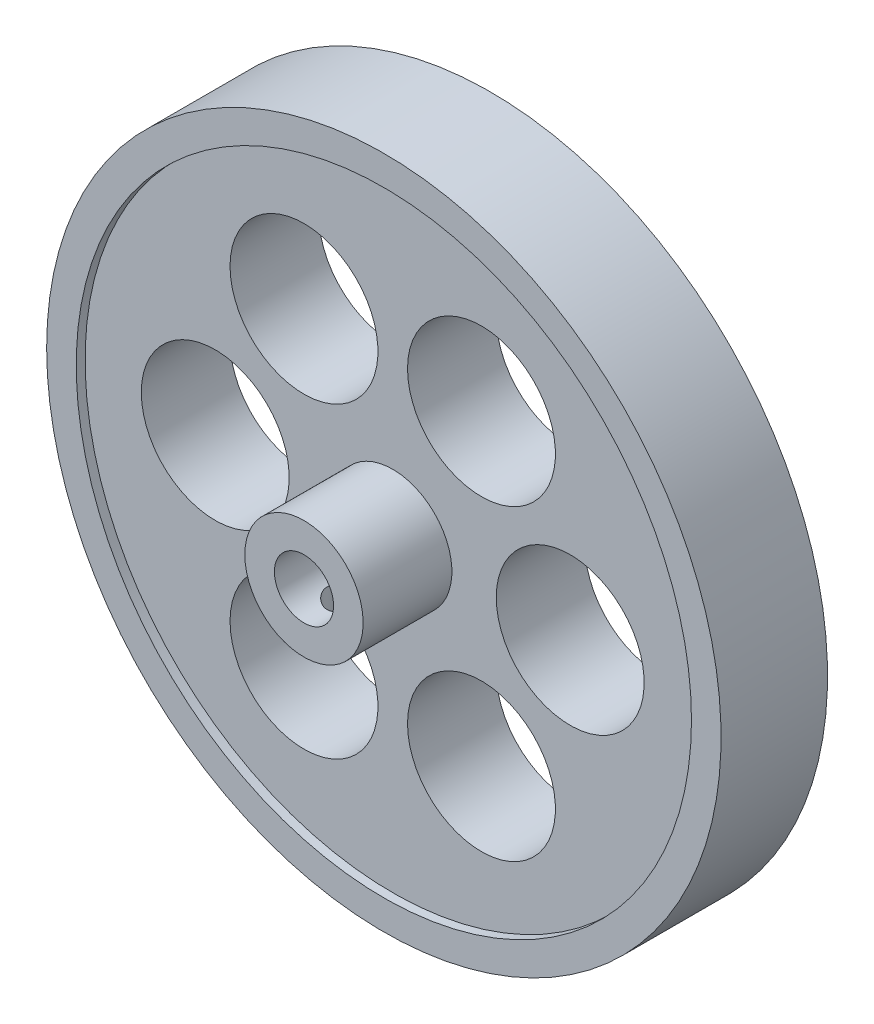
ISO-10303-21;
HEADER;
FILE_DESCRIPTION(('STEP AP214'),'2;1');
FILE_NAME('part.step','',(''),(''),'','','');
FILE_SCHEMA(('AUTOMOTIVE_DESIGN { 1 0 10303 214 1 1 1 1 }'));
ENDSEC;
DATA;
#1=APPLICATION_CONTEXT('core data for automotive mechanical design processes');
#2=APPLICATION_PROTOCOL_DEFINITION('international standard','automotive_design',2000,#1);
#3=PRODUCT_CONTEXT('',#1,'mechanical');
#4=PRODUCT('Part','Part','',(#3));
#5=PRODUCT_RELATED_PRODUCT_CATEGORY('part','',(#4));
#6=PRODUCT_DEFINITION_FORMATION('','',#4);
#7=PRODUCT_DEFINITION_CONTEXT('part definition',#1,'design');
#8=PRODUCT_DEFINITION('design','',#6,#7);
#9=PRODUCT_DEFINITION_SHAPE('','',#8);
#10=(LENGTH_UNIT() NAMED_UNIT(*) SI_UNIT(.MILLI.,.METRE.));
#11=(NAMED_UNIT(*) PLANE_ANGLE_UNIT() SI_UNIT($,.RADIAN.));
#12=(NAMED_UNIT(*) SI_UNIT($,.STERADIAN.) SOLID_ANGLE_UNIT());
#13=UNCERTAINTY_MEASURE_WITH_UNIT(LENGTH_MEASURE(1.E-05),#10,'distance_accuracy_value','');
#14=(GEOMETRIC_REPRESENTATION_CONTEXT(3) GLOBAL_UNCERTAINTY_ASSIGNED_CONTEXT((#13)) GLOBAL_UNIT_ASSIGNED_CONTEXT((#10,
#11,#12)) REPRESENTATION_CONTEXT('',''));
#15=CARTESIAN_POINT('',(0.,0.,0.));
#16=DIRECTION('',(0.,0.,1.));
#17=DIRECTION('',(1.,0.,0.));
#18=AXIS2_PLACEMENT_3D('',#15,#16,#17);
#19=CARTESIAN_POINT('',(0.,0.,9.));
#20=DIRECTION('',(0.,0.,-1.));
#21=DIRECTION('',(-1.,0.,0.));
#22=AXIS2_PLACEMENT_3D('',#19,#20,#21);
#23=CYLINDRICAL_SURFACE('',#22,57.);
#24=CARTESIAN_POINT('',(0.,0.,9.));
#25=DIRECTION('',(0.,0.,-1.));
#26=DIRECTION('',(-1.,0.,0.));
#27=AXIS2_PLACEMENT_3D('',#24,#25,#26);
#28=CIRCLE('',#27,57.);
#29=CARTESIAN_POINT('',(-57.,0.,9.));
#30=VERTEX_POINT('',#29);
#31=EDGE_CURVE('E10',#30,#30,#28,.T.);
#32=ORIENTED_EDGE('',*,*,#31,.T.);
#33=EDGE_LOOP('',(#32));
#34=FACE_BOUND('',#33,.T.);
#35=CARTESIAN_POINT('',(0.,0.,-9.));
#36=DIRECTION('',(0.,0.,-1.));
#37=DIRECTION('',(-1.,0.,0.));
#38=AXIS2_PLACEMENT_3D('',#35,#36,#37);
#39=CIRCLE('',#38,57.);
#40=CARTESIAN_POINT('',(-57.,0.,-9.));
#41=VERTEX_POINT('',#40);
#42=EDGE_CURVE('E41',#41,#41,#39,.T.);
#43=ORIENTED_EDGE('',*,*,#42,.F.);
#44=EDGE_LOOP('',(#43));
#45=FACE_BOUND('',#44,.T.);
#46=ADVANCED_FACE('F35',(#34,#45),#23,.T.);
#47=CARTESIAN_POINT('',(57.,0.,9.));
#48=DIRECTION('',(0.,0.,1.));
#49=DIRECTION('',(1.,0.,0.));
#50=AXIS2_PLACEMENT_3D('',#47,#48,#49);
#51=PLANE('',#50);
#52=CARTESIAN_POINT('',(0.,0.,8.99999999999999));
#53=DIRECTION('',(0.,0.,1.));
#54=DIRECTION('',(1.,0.,0.));
#55=AXIS2_PLACEMENT_3D('',#52,#53,#54);
#56=CIRCLE('',#55,52.);
#57=CARTESIAN_POINT('',(52.,0.,8.99999999999999));
#58=VERTEX_POINT('',#57);
#59=EDGE_CURVE('E49',#58,#58,#56,.T.);
#60=ORIENTED_EDGE('',*,*,#59,.F.);
#61=EDGE_LOOP('',(#60));
#62=FACE_BOUND('',#61,.T.);
#63=ORIENTED_EDGE('',*,*,#31,.F.);
#64=EDGE_LOOP('',(#63));
#65=FACE_BOUND('',#64,.T.);
#66=ADVANCED_FACE('F121',(#62,#65),#51,.T.);
#67=CARTESIAN_POINT('',(0.,0.,-9.));
#68=DIRECTION('',(0.,0.,-1.));
#69=DIRECTION('',(-1.,0.,0.));
#70=AXIS2_PLACEMENT_3D('',#67,#68,#69);
#71=PLANE('',#70);
#72=CARTESIAN_POINT('',(0.,0.,-9.));
#73=DIRECTION('',(0.,0.,-1.));
#74=DIRECTION('',(-1.,0.,0.));
#75=AXIS2_PLACEMENT_3D('',#72,#73,#74);
#76=CIRCLE('',#75,52.);
#77=CARTESIAN_POINT('',(-52.,0.,-9.));
#78=VERTEX_POINT('',#77);
#79=EDGE_CURVE('E69',#78,#78,#76,.T.);
#80=ORIENTED_EDGE('',*,*,#79,.F.);
#81=EDGE_LOOP('',(#80));
#82=FACE_BOUND('',#81,.T.);
#83=ORIENTED_EDGE('',*,*,#42,.T.);
#84=EDGE_LOOP('',(#83));
#85=FACE_BOUND('',#84,.T.);
#86=ADVANCED_FACE('F125',(#82,#85),#71,.T.);
#87=CARTESIAN_POINT('',(0.,0.,7.50000000000009));
#88=DIRECTION('',(0.,0.,-1.));
#89=DIRECTION('',(-1.,0.,0.));
#90=AXIS2_PLACEMENT_3D('',#87,#88,#89);
#91=PLANE('',#90);
#92=CARTESIAN_POINT('',(30.,0.,7.50000000000009));
#93=DIRECTION('',(0.,0.,-1.));
#94=DIRECTION('',(-1.,0.,0.));
#95=AXIS2_PLACEMENT_3D('',#92,#93,#94);
#96=CIRCLE('',#95,12.5);
#97=CARTESIAN_POINT('',(17.5,0.,7.50000000000009));
#98=VERTEX_POINT('',#97);
#99=EDGE_CURVE('E247',#98,#98,#96,.T.);
#100=ORIENTED_EDGE('',*,*,#99,.T.);
#101=EDGE_LOOP('',(#100));
#102=FACE_BOUND('',#101,.T.);
#103=CARTESIAN_POINT('',(15.,25.9807621135332,7.50000000000009));
#104=DIRECTION('',(0.,0.,-1.));
#105=DIRECTION('',(-1.,0.,0.));
#106=AXIS2_PLACEMENT_3D('',#103,#104,#105);
#107=CIRCLE('',#106,12.5);
#108=CARTESIAN_POINT('',(2.5,25.9807621135332,7.50000000000009));
#109=VERTEX_POINT('',#108);
#110=EDGE_CURVE('E251',#109,#109,#107,.T.);
#111=ORIENTED_EDGE('',*,*,#110,.T.);
#112=EDGE_LOOP('',(#111));
#113=FACE_BOUND('',#112,.T.);
#114=CARTESIAN_POINT('',(-15.,25.9807621135332,7.50000000000009));
#115=DIRECTION('',(0.,0.,-1.));
#116=DIRECTION('',(-1.,0.,0.));
#117=AXIS2_PLACEMENT_3D('',#114,#115,#116);
#118=CIRCLE('',#117,12.5);
#119=CARTESIAN_POINT('',(-27.5,25.9807621135332,7.50000000000009));
#120=VERTEX_POINT('',#119);
#121=EDGE_CURVE('E260',#120,#120,#118,.T.);
#122=ORIENTED_EDGE('',*,*,#121,.T.);
#123=EDGE_LOOP('',(#122));
#124=FACE_BOUND('',#123,.T.);
#125=CARTESIAN_POINT('',(-30.,0.,7.50000000000009));
#126=DIRECTION('',(0.,0.,-1.));
#127=DIRECTION('',(-1.,0.,0.));
#128=AXIS2_PLACEMENT_3D('',#125,#126,#127);
#129=CIRCLE('',#128,12.5);
#130=CARTESIAN_POINT('',(-42.5,0.,7.50000000000009));
#131=VERTEX_POINT('',#130);
#132=EDGE_CURVE('E266',#131,#131,#129,.T.);
#133=ORIENTED_EDGE('',*,*,#132,.T.);
#134=EDGE_LOOP('',(#133));
#135=FACE_BOUND('',#134,.T.);
#136=CARTESIAN_POINT('',(-15.,-25.9807621135332,7.50000000000009));
#137=DIRECTION('',(0.,0.,-1.));
#138=DIRECTION('',(-1.,0.,0.));
#139=AXIS2_PLACEMENT_3D('',#136,#137,#138);
#140=CIRCLE('',#139,12.5);
#141=CARTESIAN_POINT('',(-27.5,-25.9807621135332,7.50000000000009));
#142=VERTEX_POINT('',#141);
#143=EDGE_CURVE('E272',#142,#142,#140,.T.);
#144=ORIENTED_EDGE('',*,*,#143,.T.);
#145=EDGE_LOOP('',(#144));
#146=FACE_BOUND('',#145,.T.);
#147=CARTESIAN_POINT('',(15.,-25.9807621135332,7.50000000000009));
#148=DIRECTION('',(0.,0.,-1.));
#149=DIRECTION('',(-1.,0.,0.));
#150=AXIS2_PLACEMENT_3D('',#147,#148,#149);
#151=CIRCLE('',#150,12.5);
#152=CARTESIAN_POINT('',(2.50000000000003,-25.9807621135332,7.50000000000009));
#153=VERTEX_POINT('',#152);
#154=EDGE_CURVE('E277',#153,#153,#151,.T.);
#155=ORIENTED_EDGE('',*,*,#154,.T.);
#156=EDGE_LOOP('',(#155));
#157=FACE_BOUND('',#156,.T.);
#158=CARTESIAN_POINT('',(0.,0.,7.5));
#159=DIRECTION('',(0.,0.,-1.));
#160=DIRECTION('',(-1.,0.,0.));
#161=AXIS2_PLACEMENT_3D('',#158,#159,#160);
#162=CIRCLE('',#161,10.);
#163=CARTESIAN_POINT('',(-10.,0.,7.5));
#164=VERTEX_POINT('',#163);
#165=EDGE_CURVE('E57',#164,#164,#162,.T.);
#166=ORIENTED_EDGE('',*,*,#165,.T.);
#167=EDGE_LOOP('',(#166));
#168=FACE_BOUND('',#167,.T.);
#169=CARTESIAN_POINT('',(0.,0.,7.5));
#170=DIRECTION('',(0.,0.,1.));
#171=DIRECTION('',(1.,0.,0.));
#172=AXIS2_PLACEMENT_3D('',#169,#170,#171);
#173=CIRCLE('',#172,52.);
#174=CARTESIAN_POINT('',(52.,0.,7.5));
#175=VERTEX_POINT('',#174);
#176=EDGE_CURVE('E45',#175,#175,#173,.T.);
#177=ORIENTED_EDGE('',*,*,#176,.T.);
#178=EDGE_LOOP('',(#177));
#179=FACE_BOUND('',#178,.T.);
#180=ADVANCED_FACE('F131',(#102,#113,#124,#135,#146,#157,#168,#179),#91,.F.);
#181=CARTESIAN_POINT('',(0.,0.,9.));
#182=DIRECTION('',(0.,0.,1.));
#183=DIRECTION('',(1.,0.,0.));
#184=AXIS2_PLACEMENT_3D('',#181,#182,#183);
#185=CYLINDRICAL_SURFACE('',#184,52.);
#186=ORIENTED_EDGE('',*,*,#176,.F.);
#187=EDGE_LOOP('',(#186));
#188=FACE_BOUND('',#187,.T.);
#189=ORIENTED_EDGE('',*,*,#59,.T.);
#190=EDGE_LOOP('',(#189));
#191=FACE_BOUND('',#190,.T.);
#192=ADVANCED_FACE('F117',(#188,#191),#185,.F.);
#193=CARTESIAN_POINT('',(0.,0.,22.5));
#194=DIRECTION('',(0.,0.,-1.));
#195=DIRECTION('',(-1.,0.,0.));
#196=AXIS2_PLACEMENT_3D('',#193,#194,#195);
#197=CYLINDRICAL_SURFACE('',#196,10.);
#198=CARTESIAN_POINT('',(0.,-10.,13.4));
#199=CARTESIAN_POINT('',(0.143461557343221,-9.99999771824907,13.4000036682769));
#200=CARTESIAN_POINT('',(0.286963077894559,-9.99688228198996,13.4119136458647));
#201=CARTESIAN_POINT('',(0.569840826995812,-9.98475646729491,13.4591598496704));
#202=CARTESIAN_POINT('',(0.709214888198691,-9.9757430472252,13.4945081633365));
#203=CARTESIAN_POINT('',(0.979712906927247,-9.95281743522186,13.5874106118765));
#204=CARTESIAN_POINT('',(1.11084696748464,-9.93891138592762,13.6449369111788));
#205=CARTESIAN_POINT('',(1.36160495984502,-9.90767475553459,13.780461306377));
#206=CARTESIAN_POINT('',(1.48122827636295,-9.89034399152519,13.8584604957828));
#207=CARTESIAN_POINT('',(1.70821705852407,-9.85370433253079,14.0345398186409));
#208=CARTESIAN_POINT('',(1.81529141719992,-9.83436295075869,14.1329884785875));
#209=CARTESIAN_POINT('',(2.01161083640163,-9.7960934665325,14.3463838583049));
#210=CARTESIAN_POINT('',(2.1008537196379,-9.77716541479858,14.4613325898548));
#211=CARTESIAN_POINT('',(2.26037576632186,-9.74153535708164,14.706762977488));
#212=CARTESIAN_POINT('',(2.33032380649516,-9.72487444419416,14.8374663645339));
#213=CARTESIAN_POINT('',(2.44713920878392,-9.69614116169894,15.109280815897));
#214=CARTESIAN_POINT('',(2.49401059437805,-9.68406799228924,15.2503900609876));
#215=CARTESIAN_POINT('',(2.56233845779894,-9.66621196218937,15.5357958989434));
#216=CARTESIAN_POINT('',(2.58432096580448,-9.66029912598719,15.6799582309351));
#217=CARTESIAN_POINT('',(2.60388645934351,-9.65504461184495,15.970036460028));
#218=CARTESIAN_POINT('',(2.60147376169499,-9.65570177132069,16.1159520423211));
#219=CARTESIAN_POINT('',(2.57273579210168,-9.66339645954394,16.4013194256682));
#220=CARTESIAN_POINT('',(2.54704305477523,-9.67026520564849,16.5408401958229));
#221=CARTESIAN_POINT('',(2.47348576208217,-9.68933939877218,16.8135195790601));
#222=CARTESIAN_POINT('',(2.42561951285408,-9.70154525349553,16.9466777052351));
#223=CARTESIAN_POINT('',(2.30854895360788,-9.73006942285787,17.2045199429337));
#224=CARTESIAN_POINT('',(2.23911972332897,-9.74643073829138,17.3290969742847));
#225=CARTESIAN_POINT('',(2.08105110882949,-9.7813987360906,17.5650564397454));
#226=CARTESIAN_POINT('',(1.99240811283474,-9.80000584032441,17.6764363869908));
#227=CARTESIAN_POINT('',(1.79517679870832,-9.83807473105897,17.8864584396044));
#228=CARTESIAN_POINT('',(1.68605623430295,-9.85754514926634,17.9845998214238));
#229=CARTESIAN_POINT('',(1.45266958333244,-9.89462942072742,18.1612897383358));
#230=CARTESIAN_POINT('',(1.32840295697729,-9.91224320777098,18.2398375748307));
#231=CARTESIAN_POINT('',(1.06750110603797,-9.9437292894572,18.3753161615648));
#232=CARTESIAN_POINT('',(0.930818854189979,-9.95758649283405,18.4321600835863));
#233=CARTESIAN_POINT('',(0.649396523784739,-9.97988875793858,18.5219209980723));
#234=CARTESIAN_POINT('',(0.504658123039876,-9.98833494204127,18.5548429527159));
#235=CARTESIAN_POINT('',(0.21550853125771,-9.99869525690292,18.5950479637886));
#236=CARTESIAN_POINT('',(0.0711981359237116,-10.0007828981841,18.6030122392124));
#237=CARTESIAN_POINT('',(-0.216695116771978,-9.99868786055344,18.594951845826));
#238=CARTESIAN_POINT('',(-0.360278043972312,-9.99450579544836,18.5789295253132));
#239=CARTESIAN_POINT('',(-0.640235323682914,-9.98045296846128,18.5239106848675));
#240=CARTESIAN_POINT('',(-0.776688793417189,-9.97067550708838,18.4852907377384));
#241=CARTESIAN_POINT('',(-1.04116971053158,-9.94653791412199,18.3866072970008));
#242=CARTESIAN_POINT('',(-1.16919626712278,-9.93217729898966,18.3265415407045));
#243=CARTESIAN_POINT('',(-1.41586198403351,-9.9000560553514,18.185384980979));
#244=CARTESIAN_POINT('',(-1.53427864310433,-9.88223642755649,18.1039191214288));
#245=CARTESIAN_POINT('',(-1.75600088294379,-9.84525861493933,17.9227495566745));
#246=CARTESIAN_POINT('',(-1.85930362555792,-9.82610017970574,17.8230424339404));
#247=CARTESIAN_POINT('',(-2.05071066291276,-9.78797119446692,17.6050477943329));
#248=CARTESIAN_POINT('',(-2.13833539496245,-9.76901932590703,17.4863351839507));
#249=CARTESIAN_POINT('',(-2.29242596803188,-9.73401514960831,17.2354939334921));
#250=CARTESIAN_POINT('',(-2.35889272146547,-9.71796271684751,17.1033658722659));
#251=CARTESIAN_POINT('',(-2.46828068475577,-9.69075688970972,16.8301277902904));
#252=CARTESIAN_POINT('',(-2.51134014205601,-9.67957480995864,16.6890761239693));
#253=CARTESIAN_POINT('',(-2.57303487443038,-9.66336009357408,16.4013965703702));
#254=CARTESIAN_POINT('',(-2.59167601891696,-9.65832597917825,16.2547700318433));
#255=CARTESIAN_POINT('',(-2.60367976027313,-9.65509626301818,15.9650003325922));
#256=CARTESIAN_POINT('',(-2.59781133859024,-9.65669262299115,15.8218908559642));
#257=CARTESIAN_POINT('',(-2.56273659838172,-9.66605938255622,15.5387774693245));
#258=CARTESIAN_POINT('',(-2.53353082522868,-9.67382963787,15.3987734868188));
#259=CARTESIAN_POINT('',(-2.4530459325271,-9.69454800700704,15.1267594461531));
#260=CARTESIAN_POINT('',(-2.40192214562752,-9.70745963895466,14.9947004550404));
#261=CARTESIAN_POINT('',(-2.27917380239355,-9.73700848796251,14.7409363391908));
#262=CARTESIAN_POINT('',(-2.20754617828311,-9.75364626244559,14.6192327673653));
#263=CARTESIAN_POINT('',(-2.04346026045224,-9.78935628489379,14.3859450654615));
#264=CARTESIAN_POINT('',(-1.95047359785644,-9.80848376717168,14.2747409713166));
#265=CARTESIAN_POINT('',(-1.74732412955849,-9.84670109478601,14.0692650504242));
#266=CARTESIAN_POINT('',(-1.63715719587219,-9.86579092995759,13.9749973047979));
#267=CARTESIAN_POINT('',(-1.40011119788574,-9.90223895737583,13.8042197077617));
#268=CARTESIAN_POINT('',(-1.27294157409667,-9.91955480299503,13.7281033928161));
#269=CARTESIAN_POINT('',(-1.00716820299806,-9.9500475959979,13.5984504012807));
#270=CARTESIAN_POINT('',(-0.868572220034169,-9.96322732512439,13.5448985406385));
#271=CARTESIAN_POINT('',(-0.608648981246485,-9.98215850056674,13.4692745264571));
#272=CARTESIAN_POINT('',(-0.488491661745827,-9.9888014586315,13.4433551859365));
#273=CARTESIAN_POINT('',(-0.245565833172071,-9.99772299148383,13.4087171150103));
#274=CARTESIAN_POINT('',(-0.122797556506496,-10.0000019530907,13.3999968600965));
#275=CARTESIAN_POINT('',(0.,-10.,13.4));
#276=B_SPLINE_CURVE_WITH_KNOTS('',3,(#198,#199,#200,#201,#202,#203,#204,#205,#206,#207,#208,
#209,#210,#211,#212,#213,#214,#215,#216,#217,#218,#219,#220,#221,#222,#223,#224,#225,#226,#227,
#228,#229,#230,#231,#232,#233,#234,#235,#236,#237,#238,#239,#240,#241,#242,#243,#244,#245,#246,
#247,#248,#249,#250,#251,#252,#253,#254,#255,#256,#257,#258,#259,#260,#261,#262,#263,#264,#265,
#266,#267,#268,#269,#270,#271,#272,#273,#274,#275),.UNSPECIFIED.,.T.,.F.,(4,2,2,2,2,2,2,2,2,2,2,
2,2,2,2,2,2,2,2,2,2,2,2,2,2,2,2,2,2,2,2,2,2,2,2,2,2,2,4),(0.,0.429934474066829,
0.860090843440718,1.2897090723579,1.71935025296283,2.15753633720072,2.59577589293957,
3.04112475628264,3.48639594429566,3.92206951869643,4.35766600046567,4.78177068780133,
5.20590777835263,5.63462664248514,6.06342616653081,6.50549258454897,6.94757476196666,
7.39140744168552,7.83514803004378,8.2666662621795,8.69814225126949,9.12262491558315,
9.54715237912452,9.9796839209379,10.4122965813724,10.856462519252,11.3006093003833,
11.7421035592481,12.1834916769672,12.6111370956013,13.0387725208445,13.4634261367134,
13.888143322328,14.3247845723566,14.7615308983275,15.2070257711669,15.652220381372,
16.0202603229322,16.3882676403699),.UNSPECIFIED.);
#277=CARTESIAN_POINT('',(0.,-10.,13.4));
#278=VERTEX_POINT('',#277);
#279=EDGE_CURVE('E72',#278,#278,#276,.T.);
#280=ORIENTED_EDGE('',*,*,#279,.F.);
#281=EDGE_LOOP('',(#280));
#282=FACE_BOUND('',#281,.T.);
#283=CARTESIAN_POINT('',(0.,0.,22.5));
#284=DIRECTION('',(0.,0.,-1.));
#285=DIRECTION('',(-1.,0.,0.));
#286=AXIS2_PLACEMENT_3D('',#283,#284,#285);
#287=CIRCLE('',#286,10.);
#288=CARTESIAN_POINT('',(-10.,0.,22.5));
#289=VERTEX_POINT('',#288);
#290=EDGE_CURVE('E54',#289,#289,#287,.T.);
#291=ORIENTED_EDGE('',*,*,#290,.T.);
#292=EDGE_LOOP('',(#291));
#293=FACE_BOUND('',#292,.T.);
#294=ORIENTED_EDGE('',*,*,#165,.F.);
#295=EDGE_LOOP('',(#294));
#296=FACE_BOUND('',#295,.T.);
#297=ADVANCED_FACE('F86',(#282,#293,#296),#197,.T.);
#298=CARTESIAN_POINT('',(10.,0.,22.5));
#299=DIRECTION('',(0.,0.,1.));
#300=DIRECTION('',(1.,0.,0.));
#301=AXIS2_PLACEMENT_3D('',#298,#299,#300);
#302=PLANE('',#301);
#303=CARTESIAN_POINT('',(0.,0.,22.5));
#304=DIRECTION('',(0.,0.,-1.));
#305=DIRECTION('',(-1.,0.,0.));
#306=AXIS2_PLACEMENT_3D('',#303,#304,#305);
#307=CIRCLE('',#306,5.);
#308=CARTESIAN_POINT('',(-5.,0.,22.5));
#309=VERTEX_POINT('',#308);
#310=EDGE_CURVE('E60',#309,#309,#307,.T.);
#311=ORIENTED_EDGE('',*,*,#310,.T.);
#312=EDGE_LOOP('',(#311));
#313=FACE_BOUND('',#312,.T.);
#314=ORIENTED_EDGE('',*,*,#290,.F.);
#315=EDGE_LOOP('',(#314));
#316=FACE_BOUND('',#315,.T.);
#317=ADVANCED_FACE('F110',(#313,#316),#302,.T.);
#318=CARTESIAN_POINT('',(0.,0.,-9.));
#319=DIRECTION('',(0.,0.,-1.));
#320=DIRECTION('',(-1.,0.,0.));
#321=AXIS2_PLACEMENT_3D('',#318,#319,#320);
#322=CYLINDRICAL_SURFACE('',#321,5.00000000000001);
#323=CARTESIAN_POINT('',(0.,-5.00000000000001,13.4));
#324=CARTESIAN_POINT('',(0.136019089182941,-4.9999909610682,13.400010482763));
#325=CARTESIAN_POINT('',(0.272186596196917,-4.9943906083655,13.4107371857487));
#326=CARTESIAN_POINT('',(0.540451890325421,-4.97253564538699,13.453153499803));
#327=CARTESIAN_POINT('',(0.672542393841034,-4.95626300582207,13.4848785854471));
#328=CARTESIAN_POINT('',(0.928376677494535,-4.91475813489608,13.5676919394818));
#329=CARTESIAN_POINT('',(1.05215143971278,-4.88956163925503,13.6187030309698));
#330=CARTESIAN_POINT('',(1.28917851258908,-4.83248413590444,13.7382188894147));
#331=CARTESIAN_POINT('',(1.40243111645719,-4.80060331454072,13.8067231687077));
#332=CARTESIAN_POINT('',(1.6233350718964,-4.73065003296343,13.9642332012837));
#333=CARTESIAN_POINT('',(1.73016640462597,-4.69231213849646,14.0542690851355));
#334=CARTESIAN_POINT('',(1.9279784724862,-4.61456575351059,14.2500610052269));
#335=CARTESIAN_POINT('',(2.01894606332828,-4.57515640616842,14.3558299442917));
#336=CARTESIAN_POINT('',(2.19027363342443,-4.49581536840071,14.5908744718514));
#337=CARTESIAN_POINT('',(2.26905938178391,-4.45612765272882,14.7213871537654));
#338=CARTESIAN_POINT('',(2.40325083913202,-4.38522502172232,14.996176135082));
#339=CARTESIAN_POINT('',(2.45867414052493,-4.3540037373325,15.1404419773296));
#340=CARTESIAN_POINT('',(2.5208878360801,-4.3180591026357,15.35934332045));
#341=CARTESIAN_POINT('',(2.53788363189686,-4.30806297135276,15.4303451827657));
#342=CARTESIAN_POINT('',(2.56588556147115,-4.29144515525589,15.573893785204));
#343=CARTESIAN_POINT('',(2.57689500293829,-4.2848216070785,15.6464396491265));
#344=CARTESIAN_POINT('',(2.59273664217249,-4.27525483250756,15.7923931231528));
#345=CARTESIAN_POINT('',(2.59757332524681,-4.27230893386001,15.8658000683823));
#346=CARTESIAN_POINT('',(2.60100913746794,-4.27021647639088,16.0127899789629));
#347=CARTESIAN_POINT('',(2.59960895327092,-4.27106949932198,16.0863729240456));
#348=CARTESIAN_POINT('',(2.58725154764757,-4.27858150346759,16.2869237289943));
#349=CARTESIAN_POINT('',(2.57003361349463,-4.28904261130498,16.4134313697738));
#350=CARTESIAN_POINT('',(2.51768613987651,-4.31997055654436,16.6613280200895));
#351=CARTESIAN_POINT('',(2.48255005256885,-4.34044105157059,16.782715140861));
#352=CARTESIAN_POINT('',(2.39479130887901,-4.38948116561141,17.0204901973911));
#353=CARTESIAN_POINT('',(2.34178596159828,-4.41822582371897,17.1366995465884));
#354=CARTESIAN_POINT('',(2.22009489023023,-4.48060798128757,17.3591456235611));
#355=CARTESIAN_POINT('',(2.1514021404078,-4.51424767057286,17.4653778528239));
#356=CARTESIAN_POINT('',(1.98920130602871,-4.58825379392132,17.680366301096));
#357=CARTESIAN_POINT('',(1.89357317566943,-4.6289062362031,17.787430576558));
#358=CARTESIAN_POINT('',(1.685634103409,-4.70861352407233,17.9847405839194));
#359=CARTESIAN_POINT('',(1.57331396714203,-4.7476674739536,18.074976984451));
#360=CARTESIAN_POINT('',(1.32754824896351,-4.82233990890274,18.240698741486));
#361=CARTESIAN_POINT('',(1.19328929206127,-4.85765888994191,18.315124067835));
#362=CARTESIAN_POINT('',(0.91186193380899,-4.91824712593593,18.4396985789429));
#363=CARTESIAN_POINT('',(0.764704677415006,-4.94352495460817,18.4898684823683));
#364=CARTESIAN_POINT('',(0.475393378415223,-4.97929374619573,18.5601156556694));
#365=CARTESIAN_POINT('',(0.333920773576097,-4.99088129088932,18.5824342353131));
#366=CARTESIAN_POINT('',(0.0487884086568688,-5.00179271184052,18.6034633449198));
#367=CARTESIAN_POINT('',(-0.0948701426748796,-5.00112313603279,18.602186479914));
#368=CARTESIAN_POINT('',(-0.367236418898716,-4.98820101313895,18.5772537313521));
#369=CARTESIAN_POINT('',(-0.496174272737222,-4.97694124788485,18.5555158416516));
#370=CARTESIAN_POINT('',(-0.748282062877192,-4.94532303155869,18.4933779411504));
#371=CARTESIAN_POINT('',(-0.871451383774458,-4.92496361214025,18.4529759441796));
#372=CARTESIAN_POINT('',(-1.11236221041459,-4.8762860414791,18.3537376811491));
#373=CARTESIAN_POINT('',(-1.2298721934684,-4.84777059742843,18.2944396597188));
#374=CARTESIAN_POINT('',(-1.45363520457714,-4.78544216168874,18.1596357841363));
#375=CARTESIAN_POINT('',(-1.55988362486264,-4.7516270154978,18.0841233336488));
#376=CARTESIAN_POINT('',(-1.76985048763671,-4.67774151725365,17.9100039342819));
#377=CARTESIAN_POINT('',(-1.87215606707462,-4.63738638620223,17.8098117315791));
#378=CARTESIAN_POINT('',(-2.05919476940755,-4.55742087836658,17.593786456978));
#379=CARTESIAN_POINT('',(-2.14391327674821,-4.51781114569628,17.4779405071238));
#380=CARTESIAN_POINT('',(-2.29820544071597,-4.44140795502674,17.2253265317172));
#381=CARTESIAN_POINT('',(-2.36657947633704,-4.40492186922658,17.0877241690927));
#382=CARTESIAN_POINT('',(-2.47848196506862,-4.34295670191463,16.8004971698181));
#383=CARTESIAN_POINT('',(-2.52204467254955,-4.31746245701585,16.6508894350895));
#384=CARTESIAN_POINT('',(-2.57887997921784,-4.28373374850612,16.359457507992));
#385=CARTESIAN_POINT('',(-2.59469677869699,-4.27405597344797,16.2183015781449));
#386=CARTESIAN_POINT('',(-2.60304068355468,-4.2689836058264,15.935078040885));
#387=CARTESIAN_POINT('',(-2.59558101353197,-4.27358090282903,15.7930109968987));
#388=CARTESIAN_POINT('',(-2.56000689631849,-4.29496218799298,15.5286477860526));
#389=CARTESIAN_POINT('',(-2.53426764006932,-4.31034237455687,15.4059025263517));
#390=CARTESIAN_POINT('',(-2.46597470827394,-4.34977173854492,15.1666604475103));
#391=CARTESIAN_POINT('',(-2.42341519762214,-4.37382392411342,15.0501658127163));
#392=CARTESIAN_POINT('',(-2.3195852286097,-4.42980935571612,14.8181648508198));
#393=CARTESIAN_POINT('',(-2.25726457719192,-4.46215821753382,14.7032320277175));
#394=CARTESIAN_POINT('',(-2.11677400476042,-4.53049358739715,14.4846892918701));
#395=CARTESIAN_POINT('',(-2.03859558604294,-4.56648204058448,14.3810854960199));
#396=CARTESIAN_POINT('',(-1.85623996664035,-4.64386036010799,14.1735468775224));
#397=CARTESIAN_POINT('',(-1.74997688343791,-4.68532277564862,14.0714603584738));
#398=CARTESIAN_POINT('',(-1.52087135005594,-4.76462705804235,13.8860711058434));
#399=CARTESIAN_POINT('',(-1.39801904530502,-4.80246674986327,13.8027796163177));
#400=CARTESIAN_POINT('',(-1.13593024948445,-4.87116249883089,13.6563939622367));
#401=CARTESIAN_POINT('',(-0.99645370988422,-4.9018909091092,13.5936616234244));
#402=CARTESIAN_POINT('',(-0.779573830156968,-4.93940131172553,13.5184405192379));
#403=CARTESIAN_POINT('',(-0.706053368657951,-4.95046999161629,13.4965211915721));
#404=CARTESIAN_POINT('',(-0.556992047454957,-4.9694451440011,13.4592032121005));
#405=CARTESIAN_POINT('',(-0.481452381988612,-4.97735344337347,13.4438007928502));
#406=CARTESIAN_POINT('',(-0.338395137349239,-4.98898678907975,13.4212270117203));
#407=CARTESIAN_POINT('',(-0.271031348100012,-4.99310623532852,13.4132772366339));
#408=CARTESIAN_POINT('',(-0.135790713705165,-4.99861512842171,13.4026610536221));
#409=CARTESIAN_POINT('',(-0.0679138569131708,-5.00000451310714,13.399994765993));
#410=CARTESIAN_POINT('',(0.,-5.00000000000001,13.4));
#411=B_SPLINE_CURVE_WITH_KNOTS('',3,(#323,#324,#325,#326,#327,#328,#329,#330,#331,#332,#333,
#334,#335,#336,#337,#338,#339,#340,#341,#342,#343,#344,#345,#346,#347,#348,#349,#350,#351,#352,
#353,#354,#355,#356,#357,#358,#359,#360,#361,#362,#363,#364,#365,#366,#367,#368,#369,#370,#371,
#372,#373,#374,#375,#376,#377,#378,#379,#380,#381,#382,#383,#384,#385,#386,#387,#388,#389,#390,
#391,#392,#393,#394,#395,#396,#397,#398,#399,#400,#401,#402,#403,#404,#405,#406,#407,#408,#409,
#410),.UNSPECIFIED.,.T.,.F.,(4,2,2,2,2,2,2,2,2,2,2,2,2,2,2,2,2,2,2,2,2,2,2,2,2,2,2,2,2,2,2,2,2,
2,2,2,2,2,2,2,2,2,2,4),(0.,0.407793612732571,0.816277914644956,1.22314459375478,
1.62999993173126,2.06284652878543,2.49605008474706,2.96633035586145,3.43625586086095,
3.65704501689549,3.87771205345461,4.09821865541166,4.31870098100219,4.70102335996814,
5.0834855514743,5.47472236877361,5.86613474959106,6.31181217283483,6.75773600232578,
7.22774598817664,7.69735378515839,8.12604002906176,8.55449726913343,8.9464114109762,
9.33836726858348,9.74074892695447,10.1432945929605,10.5877141999124,11.0325016716053,
11.5037289151982,11.9743039984104,12.3988893014046,12.8232334188671,13.2006541476648,
13.5782059223776,13.9806951414759,14.3834006150385,14.8405414010836,15.2979549490921,
15.7630332001137,15.9952701904206,16.2273727397761,16.4309780328843,16.6345879616934),.UNSPECIFIED.);
#412=CARTESIAN_POINT('',(0.,-5.00000000000001,13.4));
#413=VERTEX_POINT('',#412);
#414=EDGE_CURVE('E80',#413,#413,#411,.T.);
#415=ORIENTED_EDGE('',*,*,#414,.T.);
#416=EDGE_LOOP('',(#415));
#417=FACE_BOUND('',#416,.T.);
#418=ORIENTED_EDGE('',*,*,#310,.F.);
#419=EDGE_LOOP('',(#418));
#420=FACE_BOUND('',#419,.T.);
#421=CARTESIAN_POINT('',(0.,0.,-7.5));
#422=DIRECTION('',(0.,0.,-1.));
#423=DIRECTION('',(-1.,0.,0.));
#424=AXIS2_PLACEMENT_3D('',#421,#422,#423);
#425=CIRCLE('',#424,5.00000000000001);
#426=CARTESIAN_POINT('',(-5.00000000000001,0.,-7.5));
#427=VERTEX_POINT('',#426);
#428=EDGE_CURVE('E63',#427,#427,#425,.T.);
#429=ORIENTED_EDGE('',*,*,#428,.T.);
#430=EDGE_LOOP('',(#429));
#431=FACE_BOUND('',#430,.T.);
#432=ADVANCED_FACE('F107',(#417,#420,#431),#322,.F.);
#433=CARTESIAN_POINT('',(5.00000000000001,0.,-7.5));
#434=DIRECTION('',(0.,0.,1.));
#435=DIRECTION('',(1.,0.,0.));
#436=AXIS2_PLACEMENT_3D('',#433,#434,#435);
#437=PLANE('',#436);
#438=CARTESIAN_POINT('',(30.,0.,-7.5));
#439=DIRECTION('',(0.,0.,-1.));
#440=DIRECTION('',(-1.,0.,0.));
#441=AXIS2_PLACEMENT_3D('',#438,#439,#440);
#442=CIRCLE('',#441,12.5);
#443=CARTESIAN_POINT('',(17.5,0.,-7.5));
#444=VERTEX_POINT('',#443);
#445=EDGE_CURVE('E244',#444,#444,#442,.T.);
#446=ORIENTED_EDGE('',*,*,#445,.F.);
#447=EDGE_LOOP('',(#446));
#448=FACE_BOUND('',#447,.T.);
#449=CARTESIAN_POINT('',(15.,25.9807621135332,-7.5));
#450=DIRECTION('',(0.,0.,-1.));
#451=DIRECTION('',(-1.,0.,0.));
#452=AXIS2_PLACEMENT_3D('',#449,#450,#451);
#453=CIRCLE('',#452,12.5);
#454=CARTESIAN_POINT('',(2.5,25.9807621135332,-7.5));
#455=VERTEX_POINT('',#454);
#456=EDGE_CURVE('E248',#455,#455,#453,.T.);
#457=ORIENTED_EDGE('',*,*,#456,.F.);
#458=EDGE_LOOP('',(#457));
#459=FACE_BOUND('',#458,.T.);
#460=CARTESIAN_POINT('',(-15.,25.9807621135332,-7.5));
#461=DIRECTION('',(0.,0.,-1.));
#462=DIRECTION('',(-1.,0.,0.));
#463=AXIS2_PLACEMENT_3D('',#460,#461,#462);
#464=CIRCLE('',#463,12.5);
#465=CARTESIAN_POINT('',(-27.5,25.9807621135332,-7.5));
#466=VERTEX_POINT('',#465);
#467=EDGE_CURVE('E257',#466,#466,#464,.T.);
#468=ORIENTED_EDGE('',*,*,#467,.F.);
#469=EDGE_LOOP('',(#468));
#470=FACE_BOUND('',#469,.T.);
#471=CARTESIAN_POINT('',(-30.,0.,-7.5));
#472=DIRECTION('',(0.,0.,-1.));
#473=DIRECTION('',(-1.,0.,0.));
#474=AXIS2_PLACEMENT_3D('',#471,#472,#473);
#475=CIRCLE('',#474,12.5);
#476=CARTESIAN_POINT('',(-42.5,0.,-7.5));
#477=VERTEX_POINT('',#476);
#478=EDGE_CURVE('E263',#477,#477,#475,.T.);
#479=ORIENTED_EDGE('',*,*,#478,.F.);
#480=EDGE_LOOP('',(#479));
#481=FACE_BOUND('',#480,.T.);
#482=CARTESIAN_POINT('',(-15.,-25.9807621135332,-7.5));
#483=DIRECTION('',(0.,0.,-1.));
#484=DIRECTION('',(-1.,0.,0.));
#485=AXIS2_PLACEMENT_3D('',#482,#483,#484);
#486=CIRCLE('',#485,12.5);
#487=CARTESIAN_POINT('',(-27.5,-25.9807621135332,-7.5));
#488=VERTEX_POINT('',#487);
#489=EDGE_CURVE('E269',#488,#488,#486,.T.);
#490=ORIENTED_EDGE('',*,*,#489,.F.);
#491=EDGE_LOOP('',(#490));
#492=FACE_BOUND('',#491,.T.);
#493=CARTESIAN_POINT('',(15.,-25.9807621135332,-7.5));
#494=DIRECTION('',(0.,0.,-1.));
#495=DIRECTION('',(-1.,0.,0.));
#496=AXIS2_PLACEMENT_3D('',#493,#494,#495);
#497=CIRCLE('',#496,12.5);
#498=CARTESIAN_POINT('',(2.50000000000002,-25.9807621135332,-7.5));
#499=VERTEX_POINT('',#498);
#500=EDGE_CURVE('E275',#499,#499,#497,.T.);
#501=ORIENTED_EDGE('',*,*,#500,.F.);
#502=EDGE_LOOP('',(#501));
#503=FACE_BOUND('',#502,.T.);
#504=ORIENTED_EDGE('',*,*,#428,.F.);
#505=EDGE_LOOP('',(#504));
#506=FACE_BOUND('',#505,.T.);
#507=CARTESIAN_POINT('',(0.,0.,-7.5));
#508=DIRECTION('',(0.,0.,-1.));
#509=DIRECTION('',(-1.,0.,0.));
#510=AXIS2_PLACEMENT_3D('',#507,#508,#509);
#511=CIRCLE('',#510,52.);
#512=CARTESIAN_POINT('',(-52.,0.,-7.5));
#513=VERTEX_POINT('',#512);
#514=EDGE_CURVE('E66',#513,#513,#511,.T.);
#515=ORIENTED_EDGE('',*,*,#514,.T.);
#516=EDGE_LOOP('',(#515));
#517=FACE_BOUND('',#516,.T.);
#518=ADVANCED_FACE('F103',(#448,#459,#470,#481,#492,#503,#506,#517),#437,.F.);
#519=CARTESIAN_POINT('',(0.,0.,-9.));
#520=DIRECTION('',(0.,0.,-1.));
#521=DIRECTION('',(-1.,0.,0.));
#522=AXIS2_PLACEMENT_3D('',#519,#520,#521);
#523=CYLINDRICAL_SURFACE('',#522,52.);
#524=ORIENTED_EDGE('',*,*,#514,.F.);
#525=EDGE_LOOP('',(#524));
#526=FACE_BOUND('',#525,.T.);
#527=ORIENTED_EDGE('',*,*,#79,.T.);
#528=EDGE_LOOP('',(#527));
#529=FACE_BOUND('',#528,.T.);
#530=ADVANCED_FACE('F95',(#526,#529),#523,.F.);
#531=CARTESIAN_POINT('',(0.,-10.,16.));
#532=DIRECTION('',(0.,-1.,0.));
#533=DIRECTION('',(0.,0.,-1.));
#534=AXIS2_PLACEMENT_3D('',#531,#532,#533);
#535=CYLINDRICAL_SURFACE('',#534,2.59999999999999);
#536=ORIENTED_EDGE('',*,*,#279,.T.);
#537=EDGE_LOOP('',(#536));
#538=FACE_BOUND('',#537,.T.);
#539=ORIENTED_EDGE('',*,*,#414,.F.);
#540=EDGE_LOOP('',(#539));
#541=FACE_BOUND('',#540,.T.);
#542=ADVANCED_FACE('F90',(#538,#541),#535,.F.);
#543=CARTESIAN_POINT('',(15.,-25.9807621135332,-7.5));
#544=DIRECTION('',(0.,0.,-1.));
#545=DIRECTION('',(-1.,0.,0.));
#546=AXIS2_PLACEMENT_3D('',#543,#544,#545);
#547=CYLINDRICAL_SURFACE('',#546,12.5);
#548=ORIENTED_EDGE('',*,*,#500,.T.);
#549=EDGE_LOOP('',(#548));
#550=FACE_BOUND('',#549,.T.);
#551=ORIENTED_EDGE('',*,*,#154,.F.);
#552=EDGE_LOOP('',(#551));
#553=FACE_BOUND('',#552,.T.);
#554=ADVANCED_FACE('F94',(#550,#553),#547,.F.);
#555=CARTESIAN_POINT('',(-15.,-25.9807621135332,-7.5));
#556=DIRECTION('',(0.,0.,-1.));
#557=DIRECTION('',(-1.,0.,0.));
#558=AXIS2_PLACEMENT_3D('',#555,#556,#557);
#559=CYLINDRICAL_SURFACE('',#558,12.5);
#560=ORIENTED_EDGE('',*,*,#489,.T.);
#561=EDGE_LOOP('',(#560));
#562=FACE_BOUND('',#561,.T.);
#563=ORIENTED_EDGE('',*,*,#143,.F.);
#564=EDGE_LOOP('',(#563));
#565=FACE_BOUND('',#564,.T.);
#566=ADVANCED_FACE('F189',(#562,#565),#559,.F.);
#567=CARTESIAN_POINT('',(-30.,0.,-7.5));
#568=DIRECTION('',(0.,0.,-1.));
#569=DIRECTION('',(-1.,0.,0.));
#570=AXIS2_PLACEMENT_3D('',#567,#568,#569);
#571=CYLINDRICAL_SURFACE('',#570,12.5);
#572=ORIENTED_EDGE('',*,*,#478,.T.);
#573=EDGE_LOOP('',(#572));
#574=FACE_BOUND('',#573,.T.);
#575=ORIENTED_EDGE('',*,*,#132,.F.);
#576=EDGE_LOOP('',(#575));
#577=FACE_BOUND('',#576,.T.);
#578=ADVANCED_FACE('F198',(#574,#577),#571,.F.);
#579=CARTESIAN_POINT('',(-15.,25.9807621135332,-7.5));
#580=DIRECTION('',(0.,0.,-1.));
#581=DIRECTION('',(-1.,0.,0.));
#582=AXIS2_PLACEMENT_3D('',#579,#580,#581);
#583=CYLINDRICAL_SURFACE('',#582,12.5);
#584=ORIENTED_EDGE('',*,*,#467,.T.);
#585=EDGE_LOOP('',(#584));
#586=FACE_BOUND('',#585,.T.);
#587=ORIENTED_EDGE('',*,*,#121,.F.);
#588=EDGE_LOOP('',(#587));
#589=FACE_BOUND('',#588,.T.);
#590=ADVANCED_FACE('F207',(#586,#589),#583,.F.);
#591=CARTESIAN_POINT('',(15.,25.9807621135332,-7.5));
#592=DIRECTION('',(0.,0.,-1.));
#593=DIRECTION('',(-1.,0.,0.));
#594=AXIS2_PLACEMENT_3D('',#591,#592,#593);
#595=CYLINDRICAL_SURFACE('',#594,12.5);
#596=ORIENTED_EDGE('',*,*,#456,.T.);
#597=EDGE_LOOP('',(#596));
#598=FACE_BOUND('',#597,.T.);
#599=ORIENTED_EDGE('',*,*,#110,.F.);
#600=EDGE_LOOP('',(#599));
#601=FACE_BOUND('',#600,.T.);
#602=ADVANCED_FACE('F217',(#598,#601),#595,.F.);
#603=CARTESIAN_POINT('',(30.,0.,-7.5));
#604=DIRECTION('',(0.,0.,-1.));
#605=DIRECTION('',(-1.,0.,0.));
#606=AXIS2_PLACEMENT_3D('',#603,#604,#605);
#607=CYLINDRICAL_SURFACE('',#606,12.5);
#608=ORIENTED_EDGE('',*,*,#445,.T.);
#609=EDGE_LOOP('',(#608));
#610=FACE_BOUND('',#609,.T.);
#611=ORIENTED_EDGE('',*,*,#99,.F.);
#612=EDGE_LOOP('',(#611));
#613=FACE_BOUND('',#612,.T.);
#614=ADVANCED_FACE('F227',(#610,#613),#607,.F.);
#615=CLOSED_SHELL('',(#46,#66,#86,#180,#192,#297,#317,#432,#518,#530,#542,#554,#566,#578,#590,
#602,#614));
#616=MANIFOLD_SOLID_BREP('B2',#615);
#617=ADVANCED_BREP_SHAPE_REPRESENTATION('',(#18,#616),#14);
#618=SHAPE_DEFINITION_REPRESENTATION(#9,#617);
ENDSEC;
END-ISO-10303-21;
